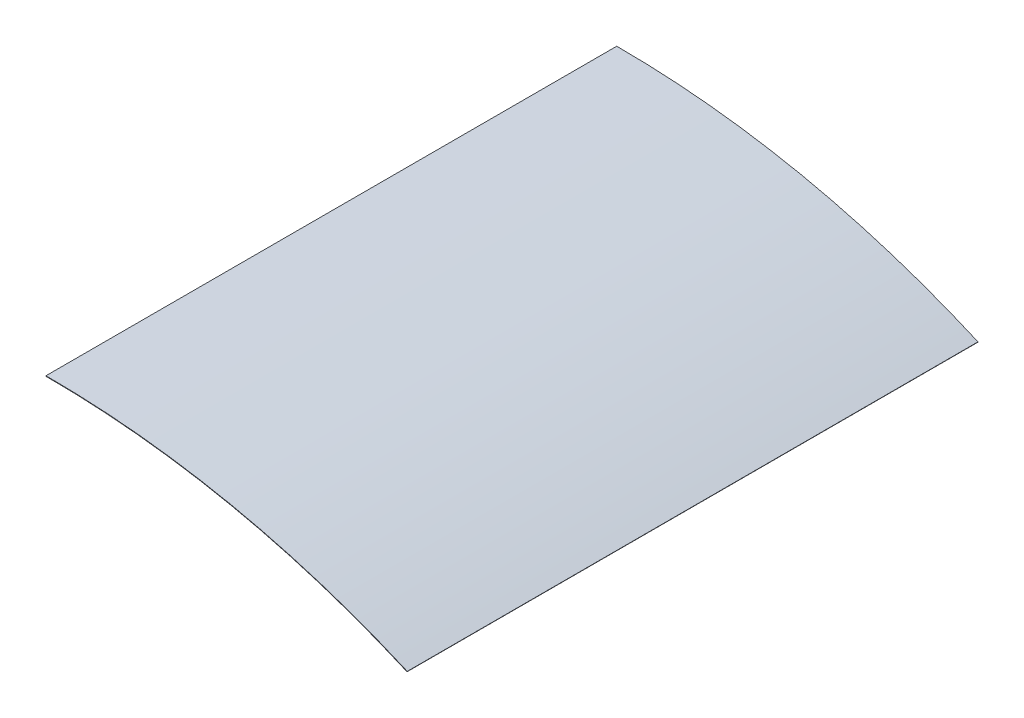
ISO-10303-21;
HEADER;
FILE_DESCRIPTION(('STEP AP214'),'2;1');
FILE_NAME('part.step','',(''),(''),'','','');
FILE_SCHEMA(('AUTOMOTIVE_DESIGN { 1 0 10303 214 1 1 1 1 }'));
ENDSEC;
DATA;
#1=APPLICATION_CONTEXT('core data for automotive mechanical design processes');
#2=APPLICATION_PROTOCOL_DEFINITION('international standard','automotive_design',2000,#1);
#3=PRODUCT_CONTEXT('',#1,'mechanical');
#4=PRODUCT('Part','Part','',(#3));
#5=PRODUCT_RELATED_PRODUCT_CATEGORY('part','',(#4));
#6=PRODUCT_DEFINITION_FORMATION('','',#4);
#7=PRODUCT_DEFINITION_CONTEXT('part definition',#1,'design');
#8=PRODUCT_DEFINITION('design','',#6,#7);
#9=PRODUCT_DEFINITION_SHAPE('','',#8);
#10=(LENGTH_UNIT() NAMED_UNIT(*) SI_UNIT(.MILLI.,.METRE.));
#11=(NAMED_UNIT(*) PLANE_ANGLE_UNIT() SI_UNIT($,.RADIAN.));
#12=(NAMED_UNIT(*) SI_UNIT($,.STERADIAN.) SOLID_ANGLE_UNIT());
#13=UNCERTAINTY_MEASURE_WITH_UNIT(LENGTH_MEASURE(1.E-05),#10,'distance_accuracy_value','');
#14=(GEOMETRIC_REPRESENTATION_CONTEXT(3) GLOBAL_UNCERTAINTY_ASSIGNED_CONTEXT((#13)) GLOBAL_UNIT_ASSIGNED_CONTEXT((#10,
#11,#12)) REPRESENTATION_CONTEXT('',''));
#15=CARTESIAN_POINT('',(0.,0.,0.));
#16=DIRECTION('',(0.,0.,1.));
#17=DIRECTION('',(1.,0.,0.));
#18=AXIS2_PLACEMENT_3D('',#15,#16,#17);
#19=CARTESIAN_POINT('',(0.,-8640.,-5460.));
#20=DIRECTION('',(0.,0.,1.));
#21=DIRECTION('',(1.,0.,0.));
#22=AXIS2_PLACEMENT_3D('',#19,#20,#21);
#23=CYLINDRICAL_SURFACE('',#22,8635.);
#24=CARTESIAN_POINT('',(0.,-8640.,0.));
#25=DIRECTION('',(0.,0.,1.));
#26=DIRECTION('',(1.,0.,0.));
#27=AXIS2_PLACEMENT_3D('',#24,#25,#26);
#28=CIRCLE('',#27,8635.);
#29=CARTESIAN_POINT('',(-1.38861390799578E-12,-5.00000000000078,0.));
#30=VERTEX_POINT('',#29);
#31=CARTESIAN_POINT('',(3454.,-725.891774811264,0.));
#32=VERTEX_POINT('',#31);
#33=EDGE_CURVE('E100',#30,#32,#28,.F.);
#34=ORIENTED_EDGE('',*,*,#33,.F.);
#35=DIRECTION('',(0.,0.,1.));
#36=VECTOR('',#35,1.);
#37=CARTESIAN_POINT('',(-1.38861390799578E-12,-5.00000000000078,-5460.));
#38=LINE('',#37,#36);
#39=CARTESIAN_POINT('',(-1.38861390799578E-12,-5.00000000000078,-5460.));
#40=VERTEX_POINT('',#39);
#41=EDGE_CURVE('E11',#40,#30,#38,.T.);
#42=ORIENTED_EDGE('',*,*,#41,.F.);
#43=CARTESIAN_POINT('',(0.,-8640.,-5460.));
#44=DIRECTION('',(0.,0.,1.));
#45=DIRECTION('',(1.,0.,0.));
#46=AXIS2_PLACEMENT_3D('',#43,#44,#45);
#47=CIRCLE('',#46,8635.);
#48=CARTESIAN_POINT('',(3454.,-725.891774811264,-5460.));
#49=VERTEX_POINT('',#48);
#50=EDGE_CURVE('E95',#40,#49,#47,.F.);
#51=ORIENTED_EDGE('',*,*,#50,.T.);
#52=DIRECTION('',(0.,0.,1.));
#53=VECTOR('',#52,1.);
#54=CARTESIAN_POINT('',(3454.,-725.891774811264,-5460.));
#55=LINE('',#54,#53);
#56=EDGE_CURVE('E38',#49,#32,#55,.T.);
#57=ORIENTED_EDGE('',*,*,#56,.T.);
#58=EDGE_LOOP('',(#34,#42,#51,#57));
#59=FACE_BOUND('',#58,.T.);
#60=ADVANCED_FACE('F35',(#59),#23,.F.);
#61=CARTESIAN_POINT('',(-1.38861390799578E-12,-5.00000000000078,-5460.));
#62=DIRECTION('',(1.,-1.71913298152797E-13,0.));
#63=DIRECTION('',(1.71913298152797E-13,1.,0.));
#64=AXIS2_PLACEMENT_3D('',#61,#62,#63);
#65=PLANE('',#64);
#66=DIRECTION('',(1.71913298152797E-13,1.,0.));
#67=VECTOR('',#66,1.);
#68=CARTESIAN_POINT('',(-1.38861390799578E-12,-5.00000000000078,0.));
#69=LINE('',#68,#67);
#70=CARTESIAN_POINT('',(-5.29047417231657E-13,0.,0.));
#71=VERTEX_POINT('',#70);
#72=EDGE_CURVE('E68',#30,#71,#69,.T.);
#73=ORIENTED_EDGE('',*,*,#72,.T.);
#74=DIRECTION('',(0.,0.,1.));
#75=VECTOR('',#74,1.);
#76=CARTESIAN_POINT('',(-5.29047417231657E-13,0.,-5460.));
#77=LINE('',#76,#75);
#78=CARTESIAN_POINT('',(-5.29047417231657E-13,0.,-5460.));
#79=VERTEX_POINT('',#78);
#80=EDGE_CURVE('E44',#79,#71,#77,.T.);
#81=ORIENTED_EDGE('',*,*,#80,.F.);
#82=DIRECTION('',(1.71913298152797E-13,1.,0.));
#83=VECTOR('',#82,1.);
#84=CARTESIAN_POINT('',(-1.38861390799578E-12,-5.00000000000078,-5460.));
#85=LINE('',#84,#83);
#86=EDGE_CURVE('E83',#40,#79,#85,.T.);
#87=ORIENTED_EDGE('',*,*,#86,.F.);
#88=ORIENTED_EDGE('',*,*,#41,.T.);
#89=EDGE_LOOP('',(#73,#81,#87,#88));
#90=FACE_BOUND('',#89,.T.);
#91=ADVANCED_FACE('F110',(#90),#65,.F.);
#92=CARTESIAN_POINT('',(0.,-8640.,-5460.));
#93=DIRECTION('',(0.,0.,1.));
#94=DIRECTION('',(1.,0.,0.));
#95=AXIS2_PLACEMENT_3D('',#92,#93,#94);
#96=CYLINDRICAL_SURFACE('',#95,8640.);
#97=CARTESIAN_POINT('',(0.,-8640.,0.));
#98=DIRECTION('',(0.,0.,-1.));
#99=DIRECTION('',(-1.,0.,0.));
#100=AXIS2_PLACEMENT_3D('',#97,#98,#99);
#101=CIRCLE('',#100,8640.);
#102=CARTESIAN_POINT('',(3456.,-721.309199116309,0.));
#103=VERTEX_POINT('',#102);
#104=EDGE_CURVE('E90',#71,#103,#101,.T.);
#105=ORIENTED_EDGE('',*,*,#104,.T.);
#106=DIRECTION('',(0.,0.,1.));
#107=VECTOR('',#106,1.);
#108=CARTESIAN_POINT('',(3456.,-721.309199116309,-5460.));
#109=LINE('',#108,#107);
#110=CARTESIAN_POINT('',(3456.,-721.309199116309,-5460.));
#111=VERTEX_POINT('',#110);
#112=EDGE_CURVE('E87',#111,#103,#109,.T.);
#113=ORIENTED_EDGE('',*,*,#112,.F.);
#114=CARTESIAN_POINT('',(0.,-8640.,-5460.));
#115=DIRECTION('',(0.,0.,-1.));
#116=DIRECTION('',(-1.,0.,0.));
#117=AXIS2_PLACEMENT_3D('',#114,#115,#116);
#118=CIRCLE('',#117,8640.);
#119=EDGE_CURVE('E80',#79,#111,#118,.T.);
#120=ORIENTED_EDGE('',*,*,#119,.F.);
#121=ORIENTED_EDGE('',*,*,#80,.T.);
#122=EDGE_LOOP('',(#105,#113,#120,#121));
#123=FACE_BOUND('',#122,.T.);
#124=ADVANCED_FACE('F88',(#123),#96,.T.);
#125=CARTESIAN_POINT('',(3456.,-721.309199116309,-5460.));
#126=DIRECTION('',(-0.916515138991089,0.400000000000181,0.));
#127=DIRECTION('',(-0.400000000000181,-0.916515138991089,0.));
#128=AXIS2_PLACEMENT_3D('',#125,#126,#127);
#129=PLANE('',#128);
#130=DIRECTION('',(-0.400000000000181,-0.916515138991089,0.));
#131=VECTOR('',#130,1.);
#132=CARTESIAN_POINT('',(3456.,-721.309199116309,0.));
#133=LINE('',#132,#131);
#134=EDGE_CURVE('E103',#103,#32,#133,.T.);
#135=ORIENTED_EDGE('',*,*,#134,.T.);
#136=ORIENTED_EDGE('',*,*,#56,.F.);
#137=DIRECTION('',(-0.400000000000181,-0.916515138991089,0.));
#138=VECTOR('',#137,1.);
#139=CARTESIAN_POINT('',(3456.,-721.309199116309,-5460.));
#140=LINE('',#139,#138);
#141=EDGE_CURVE('E77',#111,#49,#140,.T.);
#142=ORIENTED_EDGE('',*,*,#141,.F.);
#143=ORIENTED_EDGE('',*,*,#112,.T.);
#144=EDGE_LOOP('',(#135,#136,#142,#143));
#145=FACE_BOUND('',#144,.T.);
#146=ADVANCED_FACE('F94',(#145),#129,.F.);
#147=CARTESIAN_POINT('',(0.,-8640.,-5460.));
#148=DIRECTION('',(0.,0.,1.));
#149=DIRECTION('',(1.,0.,0.));
#150=AXIS2_PLACEMENT_3D('',#147,#148,#149);
#151=PLANE('',#150);
#152=ORIENTED_EDGE('',*,*,#50,.F.);
#153=ORIENTED_EDGE('',*,*,#86,.T.);
#154=ORIENTED_EDGE('',*,*,#119,.T.);
#155=ORIENTED_EDGE('',*,*,#141,.T.);
#156=EDGE_LOOP('',(#152,#153,#154,#155));
#157=FACE_BOUND('',#156,.T.);
#158=ADVANCED_FACE('F82',(#157),#151,.F.);
#159=CARTESIAN_POINT('',(0.,-8640.,0.));
#160=DIRECTION('',(0.,0.,1.));
#161=DIRECTION('',(1.,0.,0.));
#162=AXIS2_PLACEMENT_3D('',#159,#160,#161);
#163=PLANE('',#162);
#164=ORIENTED_EDGE('',*,*,#33,.T.);
#165=ORIENTED_EDGE('',*,*,#134,.F.);
#166=ORIENTED_EDGE('',*,*,#104,.F.);
#167=ORIENTED_EDGE('',*,*,#72,.F.);
#168=EDGE_LOOP('',(#164,#165,#166,#167));
#169=FACE_BOUND('',#168,.T.);
#170=ADVANCED_FACE('F108',(#169),#163,.T.);
#171=CLOSED_SHELL('',(#60,#91,#124,#146,#158,#170));
#172=MANIFOLD_SOLID_BREP('B2',#171);
#173=ADVANCED_BREP_SHAPE_REPRESENTATION('',(#18,#172),#14);
#174=SHAPE_DEFINITION_REPRESENTATION(#9,#173);
ENDSEC;
END-ISO-10303-21;
